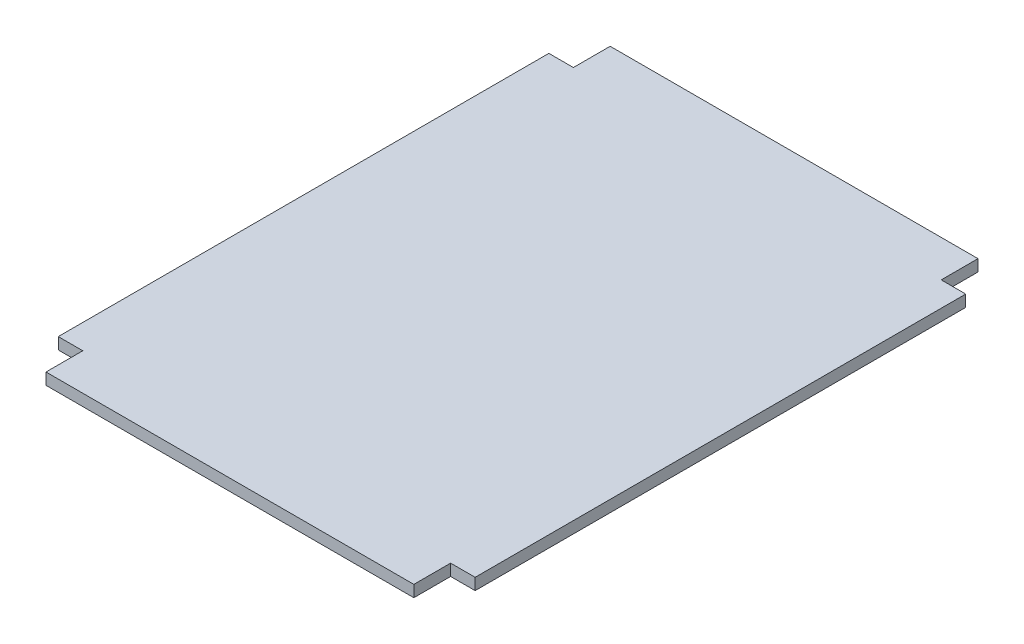
ISO-10303-21;
HEADER;
FILE_DESCRIPTION(('STEP AP214'),'2;1');
FILE_NAME('part.step','',(''),(''),'','','');
FILE_SCHEMA(('AUTOMOTIVE_DESIGN { 1 0 10303 214 1 1 1 1 }'));
ENDSEC;
DATA;
#1=APPLICATION_CONTEXT('core data for automotive mechanical design processes');
#2=APPLICATION_PROTOCOL_DEFINITION('international standard','automotive_design',2000,#1);
#3=PRODUCT_CONTEXT('',#1,'mechanical');
#4=PRODUCT('Part','Part','',(#3));
#5=PRODUCT_RELATED_PRODUCT_CATEGORY('part','',(#4));
#6=PRODUCT_DEFINITION_FORMATION('','',#4);
#7=PRODUCT_DEFINITION_CONTEXT('part definition',#1,'design');
#8=PRODUCT_DEFINITION('design','',#6,#7);
#9=PRODUCT_DEFINITION_SHAPE('','',#8);
#10=(LENGTH_UNIT() NAMED_UNIT(*) SI_UNIT(.MILLI.,.METRE.));
#11=(NAMED_UNIT(*) PLANE_ANGLE_UNIT() SI_UNIT($,.RADIAN.));
#12=(NAMED_UNIT(*) SI_UNIT($,.STERADIAN.) SOLID_ANGLE_UNIT());
#13=UNCERTAINTY_MEASURE_WITH_UNIT(LENGTH_MEASURE(1.E-05),#10,'distance_accuracy_value','');
#14=(GEOMETRIC_REPRESENTATION_CONTEXT(3) GLOBAL_UNCERTAINTY_ASSIGNED_CONTEXT((#13)) GLOBAL_UNIT_ASSIGNED_CONTEXT((#10,
#11,#12)) REPRESENTATION_CONTEXT('',''));
#15=CARTESIAN_POINT('',(0.,0.,0.));
#16=DIRECTION('',(0.,0.,1.));
#17=DIRECTION('',(1.,0.,0.));
#18=AXIS2_PLACEMENT_3D('',#15,#16,#17);
#19=CARTESIAN_POINT('',(0.,2.9972,-73.025));
#20=DIRECTION('',(0.,0.,1.));
#21=DIRECTION('',(1.,0.,0.));
#22=AXIS2_PLACEMENT_3D('',#19,#20,#21);
#23=PLANE('',#22);
#24=DIRECTION('',(-1.,0.,0.));
#25=VECTOR('',#24,1.);
#26=CARTESIAN_POINT('',(0.,0.,-73.025));
#27=LINE('',#26,#25);
#28=CARTESIAN_POINT('',(47.6123,0.,-73.025));
#29=VERTEX_POINT('',#28);
#30=CARTESIAN_POINT('',(-47.6122999999999,0.,-73.025));
#31=VERTEX_POINT('',#30);
#32=EDGE_CURVE('E166',#29,#31,#27,.T.);
#33=ORIENTED_EDGE('',*,*,#32,.T.);
#34=DIRECTION('',(0.,-1.,0.));
#35=VECTOR('',#34,1.);
#36=CARTESIAN_POINT('',(-47.6122999999999,2.9972,-73.025));
#37=LINE('',#36,#35);
#38=CARTESIAN_POINT('',(-47.6122999999999,2.9972,-73.025));
#39=VERTEX_POINT('',#38);
#40=EDGE_CURVE('E11',#39,#31,#37,.T.);
#41=ORIENTED_EDGE('',*,*,#40,.F.);
#42=DIRECTION('',(-1.,0.,0.));
#43=VECTOR('',#42,1.);
#44=CARTESIAN_POINT('',(0.,2.9972,-73.025));
#45=LINE('',#44,#43);
#46=CARTESIAN_POINT('',(47.6123,2.9972,-73.025));
#47=VERTEX_POINT('',#46);
#48=EDGE_CURVE('E210',#47,#39,#45,.T.);
#49=ORIENTED_EDGE('',*,*,#48,.F.);
#50=DIRECTION('',(0.,-1.,0.));
#51=VECTOR('',#50,1.);
#52=CARTESIAN_POINT('',(47.6123,2.9972,-73.025));
#53=LINE('',#52,#51);
#54=EDGE_CURVE('E58',#47,#29,#53,.T.);
#55=ORIENTED_EDGE('',*,*,#54,.T.);
#56=EDGE_LOOP('',(#33,#41,#49,#55));
#57=FACE_BOUND('',#56,.T.);
#58=ADVANCED_FACE('F41',(#57),#23,.F.);
#59=CARTESIAN_POINT('',(-47.6122999999999,2.9972,0.));
#60=DIRECTION('',(1.,0.,0.));
#61=DIRECTION('',(0.,0.,-1.));
#62=AXIS2_PLACEMENT_3D('',#59,#60,#61);
#63=PLANE('',#62);
#64=DIRECTION('',(0.,0.,1.));
#65=VECTOR('',#64,1.);
#66=CARTESIAN_POINT('',(-47.6122999999999,0.,0.));
#67=LINE('',#66,#65);
#68=CARTESIAN_POINT('',(-47.6122999999999,0.,-63.5));
#69=VERTEX_POINT('',#68);
#70=EDGE_CURVE('E169',#31,#69,#67,.T.);
#71=ORIENTED_EDGE('',*,*,#70,.T.);
#72=DIRECTION('',(0.,-1.,0.));
#73=VECTOR('',#72,1.);
#74=CARTESIAN_POINT('',(-47.6122999999999,2.9972,-63.5));
#75=LINE('',#74,#73);
#76=CARTESIAN_POINT('',(-47.6122999999999,2.9972,-63.5));
#77=VERTEX_POINT('',#76);
#78=EDGE_CURVE('E50',#77,#69,#75,.T.);
#79=ORIENTED_EDGE('',*,*,#78,.F.);
#80=DIRECTION('',(0.,0.,1.));
#81=VECTOR('',#80,1.);
#82=CARTESIAN_POINT('',(-47.6122999999999,2.9972,0.));
#83=LINE('',#82,#81);
#84=EDGE_CURVE('E109',#39,#77,#83,.T.);
#85=ORIENTED_EDGE('',*,*,#84,.F.);
#86=ORIENTED_EDGE('',*,*,#40,.T.);
#87=EDGE_LOOP('',(#71,#79,#85,#86));
#88=FACE_BOUND('',#87,.T.);
#89=ADVANCED_FACE('F241',(#88),#63,.F.);
#90=CARTESIAN_POINT('',(0.,2.9972,-63.5));
#91=DIRECTION('',(0.,0.,-1.));
#92=DIRECTION('',(-1.,0.,0.));
#93=AXIS2_PLACEMENT_3D('',#90,#91,#92);
#94=PLANE('',#93);
#95=DIRECTION('',(1.,0.,0.));
#96=VECTOR('',#95,1.);
#97=CARTESIAN_POINT('',(0.,0.,-63.5));
#98=LINE('',#97,#96);
#99=CARTESIAN_POINT('',(-53.9622999999999,0.,-63.5));
#100=VERTEX_POINT('',#99);
#101=EDGE_CURVE('E173',#100,#69,#98,.T.);
#102=ORIENTED_EDGE('',*,*,#101,.F.);
#103=DIRECTION('',(0.,-1.,0.));
#104=VECTOR('',#103,1.);
#105=CARTESIAN_POINT('',(-53.9622999999999,2.9972,-63.5));
#106=LINE('',#105,#104);
#107=CARTESIAN_POINT('',(-53.9622999999999,2.9972,-63.5));
#108=VERTEX_POINT('',#107);
#109=EDGE_CURVE('E232',#108,#100,#106,.T.);
#110=ORIENTED_EDGE('',*,*,#109,.F.);
#111=DIRECTION('',(1.,0.,0.));
#112=VECTOR('',#111,1.);
#113=CARTESIAN_POINT('',(0.,2.9972,-63.5));
#114=LINE('',#113,#112);
#115=EDGE_CURVE('E240',#108,#77,#114,.T.);
#116=ORIENTED_EDGE('',*,*,#115,.T.);
#117=ORIENTED_EDGE('',*,*,#78,.T.);
#118=EDGE_LOOP('',(#102,#110,#116,#117));
#119=FACE_BOUND('',#118,.T.);
#120=ADVANCED_FACE('F238',(#119),#94,.T.);
#121=CARTESIAN_POINT('',(-53.9622999999999,2.9972,0.));
#122=DIRECTION('',(-1.,0.,0.));
#123=DIRECTION('',(0.,0.,1.));
#124=AXIS2_PLACEMENT_3D('',#121,#122,#123);
#125=PLANE('',#124);
#126=DIRECTION('',(0.,0.,-1.));
#127=VECTOR('',#126,1.);
#128=CARTESIAN_POINT('',(-53.9622999999999,0.,0.));
#129=LINE('',#128,#127);
#130=CARTESIAN_POINT('',(-53.9622999999999,0.,63.5));
#131=VERTEX_POINT('',#130);
#132=EDGE_CURVE('E177',#131,#100,#129,.T.);
#133=ORIENTED_EDGE('',*,*,#132,.F.);
#134=DIRECTION('',(0.,-1.,0.));
#135=VECTOR('',#134,1.);
#136=CARTESIAN_POINT('',(-53.9622999999999,2.9972,63.5));
#137=LINE('',#136,#135);
#138=CARTESIAN_POINT('',(-53.9622999999999,2.9972,63.5));
#139=VERTEX_POINT('',#138);
#140=EDGE_CURVE('E229',#139,#131,#137,.T.);
#141=ORIENTED_EDGE('',*,*,#140,.F.);
#142=DIRECTION('',(0.,0.,-1.));
#143=VECTOR('',#142,1.);
#144=CARTESIAN_POINT('',(-53.9622999999999,2.9972,0.));
#145=LINE('',#144,#143);
#146=EDGE_CURVE('E252',#139,#108,#145,.T.);
#147=ORIENTED_EDGE('',*,*,#146,.T.);
#148=ORIENTED_EDGE('',*,*,#109,.T.);
#149=EDGE_LOOP('',(#133,#141,#147,#148));
#150=FACE_BOUND('',#149,.T.);
#151=ADVANCED_FACE('F248',(#150),#125,.T.);
#152=CARTESIAN_POINT('',(0.,2.9972,63.5));
#153=DIRECTION('',(0.,0.,-1.));
#154=DIRECTION('',(-1.,0.,0.));
#155=AXIS2_PLACEMENT_3D('',#152,#153,#154);
#156=PLANE('',#155);
#157=DIRECTION('',(1.,0.,0.));
#158=VECTOR('',#157,1.);
#159=CARTESIAN_POINT('',(0.,0.,63.5));
#160=LINE('',#159,#158);
#161=CARTESIAN_POINT('',(-47.6122999999999,0.,63.5));
#162=VERTEX_POINT('',#161);
#163=EDGE_CURVE('E181',#131,#162,#160,.T.);
#164=ORIENTED_EDGE('',*,*,#163,.T.);
#165=DIRECTION('',(0.,-1.,0.));
#166=VECTOR('',#165,1.);
#167=CARTESIAN_POINT('',(-47.6122999999999,2.9972,63.5));
#168=LINE('',#167,#166);
#169=CARTESIAN_POINT('',(-47.6122999999999,2.9972,63.5));
#170=VERTEX_POINT('',#169);
#171=EDGE_CURVE('E226',#170,#162,#168,.T.);
#172=ORIENTED_EDGE('',*,*,#171,.F.);
#173=DIRECTION('',(1.,0.,0.));
#174=VECTOR('',#173,1.);
#175=CARTESIAN_POINT('',(0.,2.9972,63.5));
#176=LINE('',#175,#174);
#177=EDGE_CURVE('E257',#139,#170,#176,.T.);
#178=ORIENTED_EDGE('',*,*,#177,.F.);
#179=ORIENTED_EDGE('',*,*,#140,.T.);
#180=EDGE_LOOP('',(#164,#172,#178,#179));
#181=FACE_BOUND('',#180,.T.);
#182=ADVANCED_FACE('F302',(#181),#156,.F.);
#183=CARTESIAN_POINT('',(-47.6122999999999,2.9972,0.));
#184=DIRECTION('',(-1.,0.,0.));
#185=DIRECTION('',(0.,0.,1.));
#186=AXIS2_PLACEMENT_3D('',#183,#184,#185);
#187=PLANE('',#186);
#188=DIRECTION('',(0.,0.,-1.));
#189=VECTOR('',#188,1.);
#190=CARTESIAN_POINT('',(-47.6122999999999,0.,0.));
#191=LINE('',#190,#189);
#192=CARTESIAN_POINT('',(-47.6122999999999,0.,73.025));
#193=VERTEX_POINT('',#192);
#194=EDGE_CURVE('E185',#193,#162,#191,.T.);
#195=ORIENTED_EDGE('',*,*,#194,.F.);
#196=DIRECTION('',(0.,-1.,0.));
#197=VECTOR('',#196,1.);
#198=CARTESIAN_POINT('',(-47.6122999999999,2.9972,73.025));
#199=LINE('',#198,#197);
#200=CARTESIAN_POINT('',(-47.6122999999999,2.9972,73.025));
#201=VERTEX_POINT('',#200);
#202=EDGE_CURVE('E223',#201,#193,#199,.T.);
#203=ORIENTED_EDGE('',*,*,#202,.F.);
#204=DIRECTION('',(0.,0.,-1.));
#205=VECTOR('',#204,1.);
#206=CARTESIAN_POINT('',(-47.6122999999999,2.9972,0.));
#207=LINE('',#206,#205);
#208=EDGE_CURVE('E264',#201,#170,#207,.T.);
#209=ORIENTED_EDGE('',*,*,#208,.T.);
#210=ORIENTED_EDGE('',*,*,#171,.T.);
#211=EDGE_LOOP('',(#195,#203,#209,#210));
#212=FACE_BOUND('',#211,.T.);
#213=ADVANCED_FACE('F305',(#212),#187,.T.);
#214=CARTESIAN_POINT('',(0.,2.9972,73.025));
#215=DIRECTION('',(0.,0.,1.));
#216=DIRECTION('',(1.,0.,0.));
#217=AXIS2_PLACEMENT_3D('',#214,#215,#216);
#218=PLANE('',#217);
#219=DIRECTION('',(-1.,0.,0.));
#220=VECTOR('',#219,1.);
#221=CARTESIAN_POINT('',(0.,0.,73.025));
#222=LINE('',#221,#220);
#223=CARTESIAN_POINT('',(47.6123000000001,0.,73.025));
#224=VERTEX_POINT('',#223);
#225=EDGE_CURVE('E189',#224,#193,#222,.T.);
#226=ORIENTED_EDGE('',*,*,#225,.F.);
#227=DIRECTION('',(0.,-1.,0.));
#228=VECTOR('',#227,1.);
#229=CARTESIAN_POINT('',(47.6123000000001,2.9972,73.025));
#230=LINE('',#229,#228);
#231=CARTESIAN_POINT('',(47.6123000000001,2.9972,73.025));
#232=VERTEX_POINT('',#231);
#233=EDGE_CURVE('E220',#232,#224,#230,.T.);
#234=ORIENTED_EDGE('',*,*,#233,.F.);
#235=DIRECTION('',(-1.,0.,0.));
#236=VECTOR('',#235,1.);
#237=CARTESIAN_POINT('',(0.,2.9972,73.025));
#238=LINE('',#237,#236);
#239=EDGE_CURVE('E268',#232,#201,#238,.T.);
#240=ORIENTED_EDGE('',*,*,#239,.T.);
#241=ORIENTED_EDGE('',*,*,#202,.T.);
#242=EDGE_LOOP('',(#226,#234,#240,#241));
#243=FACE_BOUND('',#242,.T.);
#244=ADVANCED_FACE('F309',(#243),#218,.T.);
#245=CARTESIAN_POINT('',(47.6123000000001,2.9972,0.));
#246=DIRECTION('',(-1.,0.,0.));
#247=DIRECTION('',(0.,0.,1.));
#248=AXIS2_PLACEMENT_3D('',#245,#246,#247);
#249=PLANE('',#248);
#250=DIRECTION('',(0.,0.,-1.));
#251=VECTOR('',#250,1.);
#252=CARTESIAN_POINT('',(47.6123000000001,0.,0.));
#253=LINE('',#252,#251);
#254=CARTESIAN_POINT('',(47.6123000000001,0.,63.5));
#255=VERTEX_POINT('',#254);
#256=EDGE_CURVE('E193',#224,#255,#253,.T.);
#257=ORIENTED_EDGE('',*,*,#256,.T.);
#258=DIRECTION('',(0.,-1.,0.));
#259=VECTOR('',#258,1.);
#260=CARTESIAN_POINT('',(47.6123000000001,2.9972,63.5));
#261=LINE('',#260,#259);
#262=CARTESIAN_POINT('',(47.6123000000001,2.9972,63.5));
#263=VERTEX_POINT('',#262);
#264=EDGE_CURVE('E217',#263,#255,#261,.T.);
#265=ORIENTED_EDGE('',*,*,#264,.F.);
#266=DIRECTION('',(0.,0.,-1.));
#267=VECTOR('',#266,1.);
#268=CARTESIAN_POINT('',(47.6123000000001,2.9972,0.));
#269=LINE('',#268,#267);
#270=EDGE_CURVE('E272',#232,#263,#269,.T.);
#271=ORIENTED_EDGE('',*,*,#270,.F.);
#272=ORIENTED_EDGE('',*,*,#233,.T.);
#273=EDGE_LOOP('',(#257,#265,#271,#272));
#274=FACE_BOUND('',#273,.T.);
#275=ADVANCED_FACE('F313',(#274),#249,.F.);
#276=CARTESIAN_POINT('',(0.,2.9972,63.5));
#277=DIRECTION('',(0.,0.,1.));
#278=DIRECTION('',(1.,0.,0.));
#279=AXIS2_PLACEMENT_3D('',#276,#277,#278);
#280=PLANE('',#279);
#281=DIRECTION('',(-1.,0.,0.));
#282=VECTOR('',#281,1.);
#283=CARTESIAN_POINT('',(0.,0.,63.5));
#284=LINE('',#283,#282);
#285=CARTESIAN_POINT('',(53.9623000000001,0.,63.5));
#286=VERTEX_POINT('',#285);
#287=EDGE_CURVE('E197',#286,#255,#284,.T.);
#288=ORIENTED_EDGE('',*,*,#287,.F.);
#289=DIRECTION('',(0.,-1.,0.));
#290=VECTOR('',#289,1.);
#291=CARTESIAN_POINT('',(53.9623000000001,2.9972,63.5));
#292=LINE('',#291,#290);
#293=CARTESIAN_POINT('',(53.9623000000001,2.9972,63.5));
#294=VERTEX_POINT('',#293);
#295=EDGE_CURVE('E156',#294,#286,#292,.T.);
#296=ORIENTED_EDGE('',*,*,#295,.F.);
#297=DIRECTION('',(-1.,0.,0.));
#298=VECTOR('',#297,1.);
#299=CARTESIAN_POINT('',(0.,2.9972,63.5));
#300=LINE('',#299,#298);
#301=EDGE_CURVE('E144',#294,#263,#300,.T.);
#302=ORIENTED_EDGE('',*,*,#301,.T.);
#303=ORIENTED_EDGE('',*,*,#264,.T.);
#304=EDGE_LOOP('',(#288,#296,#302,#303));
#305=FACE_BOUND('',#304,.T.);
#306=ADVANCED_FACE('F277',(#305),#280,.T.);
#307=CARTESIAN_POINT('',(53.9623000000001,2.9972,0.));
#308=DIRECTION('',(-1.,0.,0.));
#309=DIRECTION('',(0.,0.,1.));
#310=AXIS2_PLACEMENT_3D('',#307,#308,#309);
#311=PLANE('',#310);
#312=DIRECTION('',(0.,0.,-1.));
#313=VECTOR('',#312,1.);
#314=CARTESIAN_POINT('',(53.9623000000001,0.,0.));
#315=LINE('',#314,#313);
#316=CARTESIAN_POINT('',(53.9623000000001,0.,-63.5));
#317=VERTEX_POINT('',#316);
#318=EDGE_CURVE('E152',#286,#317,#315,.T.);
#319=ORIENTED_EDGE('',*,*,#318,.T.);
#320=DIRECTION('',(0.,-1.,0.));
#321=VECTOR('',#320,1.);
#322=CARTESIAN_POINT('',(53.9623000000001,2.9972,-63.5));
#323=LINE('',#322,#321);
#324=CARTESIAN_POINT('',(53.9623000000001,2.9972,-63.5));
#325=VERTEX_POINT('',#324);
#326=EDGE_CURVE('E149',#325,#317,#323,.T.);
#327=ORIENTED_EDGE('',*,*,#326,.F.);
#328=DIRECTION('',(0.,0.,-1.));
#329=VECTOR('',#328,1.);
#330=CARTESIAN_POINT('',(53.9623000000001,2.9972,0.));
#331=LINE('',#330,#329);
#332=EDGE_CURVE('E137',#294,#325,#331,.T.);
#333=ORIENTED_EDGE('',*,*,#332,.F.);
#334=ORIENTED_EDGE('',*,*,#295,.T.);
#335=EDGE_LOOP('',(#319,#327,#333,#334));
#336=FACE_BOUND('',#335,.T.);
#337=ADVANCED_FACE('F150',(#336),#311,.F.);
#338=CARTESIAN_POINT('',(0.,2.9972,-63.5));
#339=DIRECTION('',(0.,0.,1.));
#340=DIRECTION('',(1.,0.,0.));
#341=AXIS2_PLACEMENT_3D('',#338,#339,#340);
#342=PLANE('',#341);
#343=DIRECTION('',(-1.,0.,0.));
#344=VECTOR('',#343,1.);
#345=CARTESIAN_POINT('',(0.,0.,-63.5));
#346=LINE('',#345,#344);
#347=CARTESIAN_POINT('',(47.6123000000001,0.,-63.5));
#348=VERTEX_POINT('',#347);
#349=EDGE_CURVE('E203',#317,#348,#346,.T.);
#350=ORIENTED_EDGE('',*,*,#349,.T.);
#351=DIRECTION('',(0.,-1.,0.));
#352=VECTOR('',#351,1.);
#353=CARTESIAN_POINT('',(47.6123000000001,2.9972,-63.5));
#354=LINE('',#353,#352);
#355=CARTESIAN_POINT('',(47.6123000000001,2.9972,-63.5));
#356=VERTEX_POINT('',#355);
#357=EDGE_CURVE('E97',#356,#348,#354,.T.);
#358=ORIENTED_EDGE('',*,*,#357,.F.);
#359=DIRECTION('',(-1.,0.,0.));
#360=VECTOR('',#359,1.);
#361=CARTESIAN_POINT('',(0.,2.9972,-63.5));
#362=LINE('',#361,#360);
#363=EDGE_CURVE('E142',#325,#356,#362,.T.);
#364=ORIENTED_EDGE('',*,*,#363,.F.);
#365=ORIENTED_EDGE('',*,*,#326,.T.);
#366=EDGE_LOOP('',(#350,#358,#364,#365));
#367=FACE_BOUND('',#366,.T.);
#368=ADVANCED_FACE('F158',(#367),#342,.F.);
#369=CARTESIAN_POINT('',(47.6123000000001,2.9972,0.));
#370=DIRECTION('',(1.,0.,0.));
#371=DIRECTION('',(0.,0.,-1.));
#372=AXIS2_PLACEMENT_3D('',#369,#370,#371);
#373=PLANE('',#372);
#374=DIRECTION('',(0.,0.,1.));
#375=VECTOR('',#374,1.);
#376=CARTESIAN_POINT('',(47.6123000000001,0.,0.));
#377=LINE('',#376,#375);
#378=EDGE_CURVE('E206',#29,#348,#377,.T.);
#379=ORIENTED_EDGE('',*,*,#378,.F.);
#380=ORIENTED_EDGE('',*,*,#54,.F.);
#381=DIRECTION('',(0.,0.,1.));
#382=VECTOR('',#381,1.);
#383=CARTESIAN_POINT('',(47.6123000000001,2.9972,0.));
#384=LINE('',#383,#382);
#385=EDGE_CURVE('E160',#47,#356,#384,.T.);
#386=ORIENTED_EDGE('',*,*,#385,.T.);
#387=ORIENTED_EDGE('',*,*,#357,.T.);
#388=EDGE_LOOP('',(#379,#380,#386,#387));
#389=FACE_BOUND('',#388,.T.);
#390=ADVANCED_FACE('F280',(#389),#373,.T.);
#391=CARTESIAN_POINT('',(0.,2.9972,0.));
#392=DIRECTION('',(0.,1.,0.));
#393=DIRECTION('',(0.,0.,1.));
#394=AXIS2_PLACEMENT_3D('',#391,#392,#393);
#395=PLANE('',#394);
#396=ORIENTED_EDGE('',*,*,#48,.T.);
#397=ORIENTED_EDGE('',*,*,#84,.T.);
#398=ORIENTED_EDGE('',*,*,#115,.F.);
#399=ORIENTED_EDGE('',*,*,#146,.F.);
#400=ORIENTED_EDGE('',*,*,#177,.T.);
#401=ORIENTED_EDGE('',*,*,#208,.F.);
#402=ORIENTED_EDGE('',*,*,#239,.F.);
#403=ORIENTED_EDGE('',*,*,#270,.T.);
#404=ORIENTED_EDGE('',*,*,#301,.F.);
#405=ORIENTED_EDGE('',*,*,#332,.T.);
#406=ORIENTED_EDGE('',*,*,#363,.T.);
#407=ORIENTED_EDGE('',*,*,#385,.F.);
#408=EDGE_LOOP('',(#396,#397,#398,#399,#400,#401,#402,#403,#404,#405,#406,#407));
#409=FACE_BOUND('',#408,.T.);
#410=ADVANCED_FACE('F139',(#409),#395,.T.);
#411=CARTESIAN_POINT('',(0.,0.,0.));
#412=DIRECTION('',(0.,1.,0.));
#413=DIRECTION('',(0.,0.,1.));
#414=AXIS2_PLACEMENT_3D('',#411,#412,#413);
#415=PLANE('',#414);
#416=ORIENTED_EDGE('',*,*,#32,.F.);
#417=ORIENTED_EDGE('',*,*,#378,.T.);
#418=ORIENTED_EDGE('',*,*,#349,.F.);
#419=ORIENTED_EDGE('',*,*,#318,.F.);
#420=ORIENTED_EDGE('',*,*,#287,.T.);
#421=ORIENTED_EDGE('',*,*,#256,.F.);
#422=ORIENTED_EDGE('',*,*,#225,.T.);
#423=ORIENTED_EDGE('',*,*,#194,.T.);
#424=ORIENTED_EDGE('',*,*,#163,.F.);
#425=ORIENTED_EDGE('',*,*,#132,.T.);
#426=ORIENTED_EDGE('',*,*,#101,.T.);
#427=ORIENTED_EDGE('',*,*,#70,.F.);
#428=EDGE_LOOP('',(#416,#417,#418,#419,#420,#421,#422,#423,#424,#425,#426,#427));
#429=FACE_BOUND('',#428,.T.);
#430=ADVANCED_FACE('F244',(#429),#415,.F.);
#431=CLOSED_SHELL('',(#58,#89,#120,#151,#182,#213,#244,#275,#306,#337,#368,#390,#410,#430));
#432=MANIFOLD_SOLID_BREP('B2',#431);
#433=ADVANCED_BREP_SHAPE_REPRESENTATION('',(#18,#432),#14);
#434=SHAPE_DEFINITION_REPRESENTATION(#9,#433);
ENDSEC;
END-ISO-10303-21;
